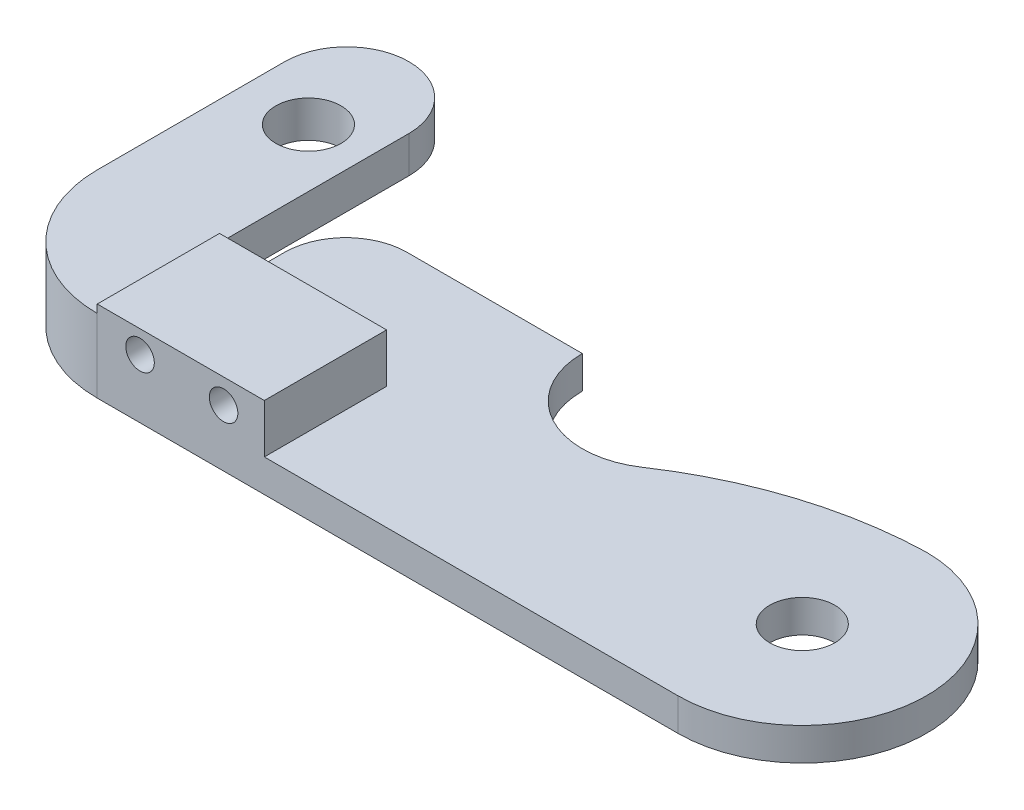
ISO-10303-21;
HEADER;
FILE_DESCRIPTION(('STEP AP214'),'2;1');
FILE_NAME('part.step','',(''),(''),'','','');
FILE_SCHEMA(('AUTOMOTIVE_DESIGN { 1 0 10303 214 1 1 1 1 }'));
ENDSEC;
DATA;
#1=APPLICATION_CONTEXT('core data for automotive mechanical design processes');
#2=APPLICATION_PROTOCOL_DEFINITION('international standard','automotive_design',2000,#1);
#3=PRODUCT_CONTEXT('',#1,'mechanical');
#4=PRODUCT('Part','Part','',(#3));
#5=PRODUCT_RELATED_PRODUCT_CATEGORY('part','',(#4));
#6=PRODUCT_DEFINITION_FORMATION('','',#4);
#7=PRODUCT_DEFINITION_CONTEXT('part definition',#1,'design');
#8=PRODUCT_DEFINITION('design','',#6,#7);
#9=PRODUCT_DEFINITION_SHAPE('','',#8);
#10=(LENGTH_UNIT() NAMED_UNIT(*) SI_UNIT(.MILLI.,.METRE.));
#11=(NAMED_UNIT(*) PLANE_ANGLE_UNIT() SI_UNIT($,.RADIAN.));
#12=(NAMED_UNIT(*) SI_UNIT($,.STERADIAN.) SOLID_ANGLE_UNIT());
#13=UNCERTAINTY_MEASURE_WITH_UNIT(LENGTH_MEASURE(1.E-05),#10,'distance_accuracy_value','');
#14=(GEOMETRIC_REPRESENTATION_CONTEXT(3) GLOBAL_UNCERTAINTY_ASSIGNED_CONTEXT((#13)) GLOBAL_UNIT_ASSIGNED_CONTEXT((#10,
#11,#12)) REPRESENTATION_CONTEXT('',''));
#15=CARTESIAN_POINT('',(0.,0.,0.));
#16=DIRECTION('',(0.,0.,1.));
#17=DIRECTION('',(1.,0.,0.));
#18=AXIS2_PLACEMENT_3D('',#15,#16,#17);
#19=CARTESIAN_POINT('',(-13.6869300911854,3.6,-4.17256838905775));
#20=DIRECTION('',(0.,0.,-1.));
#21=DIRECTION('',(-1.,0.,0.));
#22=AXIS2_PLACEMENT_3D('',#19,#20,#21);
#23=PLANE('',#22);
#24=DIRECTION('',(0.,-1.,0.));
#25=VECTOR('',#24,1.);
#26=CARTESIAN_POINT('',(-19.7869300911854,3.6,-4.17256838905775));
#27=LINE('',#26,#25);
#28=CARTESIAN_POINT('',(-19.7869300911854,1.8,-4.17256838905775));
#29=VERTEX_POINT('',#28);
#30=CARTESIAN_POINT('',(-19.7869300911854,0.,-4.17256838905775));
#31=VERTEX_POINT('',#30);
#32=EDGE_CURVE('E187',#29,#31,#27,.T.);
#33=ORIENTED_EDGE('',*,*,#32,.F.);
#34=DIRECTION('',(-1.,0.,0.));
#35=VECTOR('',#34,1.);
#36=CARTESIAN_POINT('',(-13.6869300911854,1.8,-4.17256838905775));
#37=LINE('',#36,#35);
#38=CARTESIAN_POINT('',(-13.6869300911854,1.8,-4.17256838905775));
#39=VERTEX_POINT('',#38);
#40=EDGE_CURVE('E163',#39,#29,#37,.T.);
#41=ORIENTED_EDGE('',*,*,#40,.F.);
#42=DIRECTION('',(0.,-1.,0.));
#43=VECTOR('',#42,1.);
#44=CARTESIAN_POINT('',(-13.6869300911854,3.6,-4.17256838905775));
#45=LINE('',#44,#43);
#46=CARTESIAN_POINT('',(-13.6869300911854,1.6,-4.17256838905775));
#47=VERTEX_POINT('',#46);
#48=EDGE_CURVE('E195',#39,#47,#45,.T.);
#49=ORIENTED_EDGE('',*,*,#48,.T.);
#50=CARTESIAN_POINT('',(-13.6869300911854,0.,-4.17256838905775));
#51=VERTEX_POINT('',#50);
#52=EDGE_CURVE('E197',#47,#51,#45,.T.);
#53=ORIENTED_EDGE('',*,*,#52,.T.);
#54=DIRECTION('',(1.,0.,0.));
#55=VECTOR('',#54,1.);
#56=CARTESIAN_POINT('',(-13.6869300911854,0.,-4.17256838905775));
#57=LINE('',#56,#55);
#58=EDGE_CURVE('E183',#31,#51,#57,.T.);
#59=ORIENTED_EDGE('',*,*,#58,.F.);
#60=EDGE_LOOP('',(#33,#41,#49,#53,#59));
#61=FACE_BOUND('',#60,.T.);
#62=ADVANCED_FACE('F32',(#61),#23,.T.);
#63=CARTESIAN_POINT('',(-13.6869300911854,1.6,-4.17256838905775));
#64=DIRECTION('',(1.,0.,0.));
#65=DIRECTION('',(0.,0.,-1.));
#66=AXIS2_PLACEMENT_3D('',#63,#64,#65);
#67=PLANE('',#66);
#68=DIRECTION('',(0.,0.,1.));
#69=VECTOR('',#68,1.);
#70=CARTESIAN_POINT('',(-13.6869300911854,3.6,1.92743161094225));
#71=LINE('',#70,#69);
#72=CARTESIAN_POINT('',(-13.6869300911854,3.6,-4.07256838905775));
#73=VERTEX_POINT('',#72);
#74=CARTESIAN_POINT('',(-13.6869300911854,3.6,1.92743161094225));
#75=VERTEX_POINT('',#74);
#76=EDGE_CURVE('E182',#73,#75,#71,.T.);
#77=ORIENTED_EDGE('',*,*,#76,.T.);
#78=DIRECTION('',(0.,-1.,0.));
#79=VECTOR('',#78,1.);
#80=CARTESIAN_POINT('',(-13.6869300911854,1.6,1.92743161094225));
#81=LINE('',#80,#79);
#82=CARTESIAN_POINT('',(-13.6869300911854,4.,1.92743161094225));
#83=VERTEX_POINT('',#82);
#84=EDGE_CURVE('E275',#83,#75,#81,.T.);
#85=ORIENTED_EDGE('',*,*,#84,.F.);
#86=DIRECTION('',(0.,0.,1.));
#87=VECTOR('',#86,1.);
#88=CARTESIAN_POINT('',(-13.6869300911854,4.,1.92743161094225));
#89=LINE('',#88,#87);
#90=CARTESIAN_POINT('',(-13.6869300911854,4.,-4.07256838905775));
#91=VERTEX_POINT('',#90);
#92=EDGE_CURVE('E216',#91,#83,#89,.T.);
#93=ORIENTED_EDGE('',*,*,#92,.F.);
#94=DIRECTION('',(0.,-1.,0.));
#95=VECTOR('',#94,1.);
#96=CARTESIAN_POINT('',(-13.6869300911854,4.,-4.07256838905775));
#97=LINE('',#96,#95);
#98=EDGE_CURVE('E230',#91,#73,#97,.T.);
#99=ORIENTED_EDGE('',*,*,#98,.T.);
#100=EDGE_LOOP('',(#77,#85,#93,#99));
#101=FACE_BOUND('',#100,.T.);
#102=ADVANCED_FACE('F333',(#101),#67,.F.);
#103=CARTESIAN_POINT('',(14.8130699088146,1.6,-4.17256838905775));
#104=DIRECTION('',(0.,1.,0.));
#105=DIRECTION('',(0.,0.,1.));
#106=AXIS2_PLACEMENT_3D('',#103,#104,#105);
#107=PLANE('',#106);
#108=CARTESIAN_POINT('',(14.8130699088146,1.6,-4.17256838905775));
#109=DIRECTION('',(0.,1.,0.));
#110=DIRECTION('',(0.,0.,1.));
#111=AXIS2_PLACEMENT_3D('',#108,#109,#110);
#112=CIRCLE('',#111,6.1);
#113=CARTESIAN_POINT('',(14.8130699088146,1.6,1.92743161094225));
#114=VERTEX_POINT('',#113);
#115=CARTESIAN_POINT('',(14.8130699088146,1.6,-10.2725683890578));
#116=VERTEX_POINT('',#115);
#117=EDGE_CURVE('E246',#114,#116,#112,.T.);
#118=ORIENTED_EDGE('',*,*,#117,.T.);
#119=CARTESIAN_POINT('',(15.3370849753878,1.6,9.72056563765262));
#120=DIRECTION('',(0.,1.,0.));
#121=DIRECTION('',(0.,0.,1.));
#122=AXIS2_PLACEMENT_3D('',#119,#120,#121);
#123=CIRCLE('',#122,20.);
#124=CARTESIAN_POINT('',(4.22106413000467,1.6,-6.9057412452666));
#125=VERTEX_POINT('',#124);
#126=EDGE_CURVE('E11',#116,#125,#123,.T.);
#127=ORIENTED_EDGE('',*,*,#126,.T.);
#128=CARTESIAN_POINT('',(1.97006990881458,1.6,-10.2725683890577));
#129=DIRECTION('',(0.,-1.,0.));
#130=DIRECTION('',(0.,0.,1.));
#131=AXIS2_PLACEMENT_3D('',#128,#129,#130);
#132=CIRCLE('',#131,4.05);
#133=CARTESIAN_POINT('',(-2.07993009118541,1.6,-10.2725683890577));
#134=VERTEX_POINT('',#133);
#135=EDGE_CURVE('E248',#125,#134,#132,.T.);
#136=ORIENTED_EDGE('',*,*,#135,.T.);
#137=DIRECTION('',(-1.,0.,0.));
#138=VECTOR('',#137,1.);
#139=CARTESIAN_POINT('',(-2.07993009118541,1.6,-10.2725683890577));
#140=LINE('',#139,#138);
#141=CARTESIAN_POINT('',(-10.6869300911854,1.6,-10.2725683890577));
#142=VERTEX_POINT('',#141);
#143=EDGE_CURVE('E251',#134,#142,#140,.T.);
#144=ORIENTED_EDGE('',*,*,#143,.T.);
#145=CARTESIAN_POINT('',(-10.6869300911854,1.6,-7.27256838905775));
#146=DIRECTION('',(0.,1.,0.));
#147=DIRECTION('',(0.,0.,1.));
#148=AXIS2_PLACEMENT_3D('',#145,#146,#147);
#149=CIRCLE('',#148,3.);
#150=CARTESIAN_POINT('',(-13.6869300911854,1.6,-7.27256838905775));
#151=VERTEX_POINT('',#150);
#152=EDGE_CURVE('E253',#142,#151,#149,.T.);
#153=ORIENTED_EDGE('',*,*,#152,.T.);
#154=DIRECTION('',(0.,0.,1.));
#155=VECTOR('',#154,1.);
#156=CARTESIAN_POINT('',(-13.6869300911854,1.6,-7.27256838905775));
#157=LINE('',#156,#155);
#158=EDGE_CURVE('E255',#151,#47,#157,.T.);
#159=ORIENTED_EDGE('',*,*,#158,.T.);
#160=DIRECTION('',(0.,0.,-1.));
#161=VECTOR('',#160,1.);
#162=CARTESIAN_POINT('',(-13.6869300911854,1.6,-4.17256838905775));
#163=LINE('',#162,#161);
#164=CARTESIAN_POINT('',(-13.6869300911854,1.6,-4.07256838905775));
#165=VERTEX_POINT('',#164);
#166=EDGE_CURVE('E194',#165,#47,#163,.T.);
#167=ORIENTED_EDGE('',*,*,#166,.F.);
#168=DIRECTION('',(-1.,0.,0.));
#169=VECTOR('',#168,1.);
#170=CARTESIAN_POINT('',(-13.6869300911854,1.6,-4.07256838905775));
#171=LINE('',#170,#169);
#172=CARTESIAN_POINT('',(-5.48693009118541,1.6,-4.07256838905775));
#173=VERTEX_POINT('',#172);
#174=EDGE_CURVE('E220',#173,#165,#171,.T.);
#175=ORIENTED_EDGE('',*,*,#174,.F.);
#176=DIRECTION('',(0.,0.,-1.));
#177=VECTOR('',#176,1.);
#178=CARTESIAN_POINT('',(-5.48693009118541,1.6,1.92743161094225));
#179=LINE('',#178,#177);
#180=CARTESIAN_POINT('',(-5.48693009118541,1.6,1.92743161094225));
#181=VERTEX_POINT('',#180);
#182=EDGE_CURVE('E211',#181,#173,#179,.T.);
#183=ORIENTED_EDGE('',*,*,#182,.F.);
#184=DIRECTION('',(1.,0.,0.));
#185=VECTOR('',#184,1.);
#186=CARTESIAN_POINT('',(-13.6869300911854,1.6,1.92743161094225));
#187=LINE('',#186,#185);
#188=EDGE_CURVE('E258',#181,#114,#187,.T.);
#189=ORIENTED_EDGE('',*,*,#188,.T.);
#190=EDGE_LOOP('',(#118,#127,#136,#144,#153,#159,#167,#175,#183,#189));
#191=FACE_BOUND('',#190,.T.);
#192=CARTESIAN_POINT('',(14.8130699088146,1.6,-4.17256838905775));
#193=DIRECTION('',(0.,1.,0.));
#194=DIRECTION('',(0.,0.,1.));
#195=AXIS2_PLACEMENT_3D('',#192,#193,#194);
#196=CIRCLE('',#195,1.6);
#197=CARTESIAN_POINT('',(14.8130699088146,1.6,-2.57256838905775));
#198=VERTEX_POINT('',#197);
#199=EDGE_CURVE('E240',#198,#198,#196,.T.);
#200=ORIENTED_EDGE('',*,*,#199,.F.);
#201=EDGE_LOOP('',(#200));
#202=FACE_BOUND('',#201,.T.);
#203=ADVANCED_FACE('F306',(#191,#202),#107,.T.);
#204=CARTESIAN_POINT('',(14.8130699088146,0.,-4.17256838905775));
#205=DIRECTION('',(0.,1.,0.));
#206=DIRECTION('',(0.,0.,1.));
#207=AXIS2_PLACEMENT_3D('',#204,#205,#206);
#208=PLANE('',#207);
#209=CARTESIAN_POINT('',(1.97006990881458,0.,-10.2725683890577));
#210=DIRECTION('',(0.,-1.,0.));
#211=DIRECTION('',(0.,0.,1.));
#212=AXIS2_PLACEMENT_3D('',#209,#210,#211);
#213=CIRCLE('',#212,4.05);
#214=CARTESIAN_POINT('',(4.22106413000467,0.,-6.9057412452666));
#215=VERTEX_POINT('',#214);
#216=CARTESIAN_POINT('',(-2.07993009118541,0.,-10.2725683890577));
#217=VERTEX_POINT('',#216);
#218=EDGE_CURVE('E263',#215,#217,#213,.T.);
#219=ORIENTED_EDGE('',*,*,#218,.F.);
#220=CARTESIAN_POINT('',(15.3370849753878,0.,9.72056563765262));
#221=DIRECTION('',(0.,1.,0.));
#222=DIRECTION('',(0.,0.,1.));
#223=AXIS2_PLACEMENT_3D('',#220,#221,#222);
#224=CIRCLE('',#223,20.);
#225=CARTESIAN_POINT('',(14.8130699088146,0.,-10.2725683890578));
#226=VERTEX_POINT('',#225);
#227=EDGE_CURVE('E40',#215,#226,#224,.F.);
#228=ORIENTED_EDGE('',*,*,#227,.T.);
#229=CARTESIAN_POINT('',(14.8130699088146,0.,-4.17256838905775));
#230=DIRECTION('',(0.,1.,0.));
#231=DIRECTION('',(0.,0.,1.));
#232=AXIS2_PLACEMENT_3D('',#229,#230,#231);
#233=CIRCLE('',#232,6.1);
#234=CARTESIAN_POINT('',(14.8130699088146,0.,1.92743161094225));
#235=VERTEX_POINT('',#234);
#236=EDGE_CURVE('E243',#235,#226,#233,.T.);
#237=ORIENTED_EDGE('',*,*,#236,.F.);
#238=DIRECTION('',(1.,0.,0.));
#239=VECTOR('',#238,1.);
#240=CARTESIAN_POINT('',(-13.6869300911854,0.,1.92743161094225));
#241=LINE('',#240,#239);
#242=CARTESIAN_POINT('',(-13.6869300911854,0.,1.92743161094225));
#243=VERTEX_POINT('',#242);
#244=EDGE_CURVE('E249',#243,#235,#241,.T.);
#245=ORIENTED_EDGE('',*,*,#244,.F.);
#246=CARTESIAN_POINT('',(-13.6869300911854,0.,-4.17256838905775));
#247=DIRECTION('',(0.,-1.,0.));
#248=DIRECTION('',(0.,0.,-1.));
#249=AXIS2_PLACEMENT_3D('',#246,#247,#248);
#250=CIRCLE('',#249,6.1);
#251=EDGE_CURVE('E179',#243,#31,#250,.T.);
#252=ORIENTED_EDGE('',*,*,#251,.T.);
#253=ORIENTED_EDGE('',*,*,#58,.T.);
#254=DIRECTION('',(0.,0.,1.));
#255=VECTOR('',#254,1.);
#256=CARTESIAN_POINT('',(-13.6869300911854,0.,-4.17256838905775));
#257=LINE('',#256,#255);
#258=CARTESIAN_POINT('',(-13.6869300911854,0.,-7.27256838905775));
#259=VERTEX_POINT('',#258);
#260=EDGE_CURVE('E270',#259,#51,#257,.T.);
#261=ORIENTED_EDGE('',*,*,#260,.F.);
#262=CARTESIAN_POINT('',(-10.6869300911854,0.,-7.27256838905775));
#263=DIRECTION('',(0.,1.,0.));
#264=DIRECTION('',(0.,0.,1.));
#265=AXIS2_PLACEMENT_3D('',#262,#263,#264);
#266=CIRCLE('',#265,3.);
#267=CARTESIAN_POINT('',(-10.6869300911854,0.,-10.2725683890577));
#268=VERTEX_POINT('',#267);
#269=EDGE_CURVE('E267',#268,#259,#266,.T.);
#270=ORIENTED_EDGE('',*,*,#269,.F.);
#271=DIRECTION('',(-1.,0.,0.));
#272=VECTOR('',#271,1.);
#273=CARTESIAN_POINT('',(-2.07993009118541,0.,-10.2725683890577));
#274=LINE('',#273,#272);
#275=EDGE_CURVE('E265',#217,#268,#274,.T.);
#276=ORIENTED_EDGE('',*,*,#275,.F.);
#277=EDGE_LOOP('',(#219,#228,#237,#245,#252,#253,#261,#270,#276));
#278=FACE_BOUND('',#277,.T.);
#279=CARTESIAN_POINT('',(14.8130699088146,0.,-4.17256838905775));
#280=DIRECTION('',(0.,1.,0.));
#281=DIRECTION('',(0.,0.,1.));
#282=AXIS2_PLACEMENT_3D('',#279,#280,#281);
#283=CIRCLE('',#282,1.6);
#284=CARTESIAN_POINT('',(14.8130699088146,0.,-2.57256838905775));
#285=VERTEX_POINT('',#284);
#286=EDGE_CURVE('E239',#285,#285,#283,.T.);
#287=ORIENTED_EDGE('',*,*,#286,.T.);
#288=EDGE_LOOP('',(#287));
#289=FACE_BOUND('',#288,.T.);
#290=ADVANCED_FACE('F293',(#278,#289),#208,.F.);
#291=CARTESIAN_POINT('',(14.8130699088146,1.6,-4.17256838905775));
#292=DIRECTION('',(0.,-1.,0.));
#293=DIRECTION('',(0.,0.,-1.));
#294=AXIS2_PLACEMENT_3D('',#291,#292,#293);
#295=CYLINDRICAL_SURFACE('',#294,6.1);
#296=ORIENTED_EDGE('',*,*,#236,.T.);
#297=DIRECTION('',(0.,-1.,0.));
#298=VECTOR('',#297,1.);
#299=CARTESIAN_POINT('',(14.8130699088146,1.6,-10.2725683890578));
#300=LINE('',#299,#298);
#301=EDGE_CURVE('E287',#116,#226,#300,.T.);
#302=ORIENTED_EDGE('',*,*,#301,.F.);
#303=ORIENTED_EDGE('',*,*,#117,.F.);
#304=DIRECTION('',(0.,-1.,0.));
#305=VECTOR('',#304,1.);
#306=CARTESIAN_POINT('',(14.8130699088146,1.6,1.92743161094225));
#307=LINE('',#306,#305);
#308=EDGE_CURVE('E260',#114,#235,#307,.T.);
#309=ORIENTED_EDGE('',*,*,#308,.T.);
#310=EDGE_LOOP('',(#296,#302,#303,#309));
#311=FACE_BOUND('',#310,.T.);
#312=ADVANCED_FACE('F299',(#311),#295,.T.);
#313=CARTESIAN_POINT('',(1.97006990881458,1.6,-10.2725683890577));
#314=DIRECTION('',(0.,-1.,0.));
#315=DIRECTION('',(0.,0.,-1.));
#316=AXIS2_PLACEMENT_3D('',#313,#314,#315);
#317=CYLINDRICAL_SURFACE('',#316,4.05);
#318=ORIENTED_EDGE('',*,*,#135,.F.);
#319=DIRECTION('',(0.,-1.,0.));
#320=VECTOR('',#319,1.);
#321=CARTESIAN_POINT('',(4.22106413000467,1.6,-6.9057412452666));
#322=LINE('',#321,#320);
#323=EDGE_CURVE('E289',#125,#215,#322,.T.);
#324=ORIENTED_EDGE('',*,*,#323,.T.);
#325=ORIENTED_EDGE('',*,*,#218,.T.);
#326=DIRECTION('',(0.,-1.,0.));
#327=VECTOR('',#326,1.);
#328=CARTESIAN_POINT('',(-2.07993009118541,1.6,-10.2725683890577));
#329=LINE('',#328,#327);
#330=EDGE_CURVE('E284',#134,#217,#329,.T.);
#331=ORIENTED_EDGE('',*,*,#330,.F.);
#332=EDGE_LOOP('',(#318,#324,#325,#331));
#333=FACE_BOUND('',#332,.T.);
#334=ADVANCED_FACE('F303',(#333),#317,.F.);
#335=CARTESIAN_POINT('',(-2.07993009118541,1.6,-10.2725683890577));
#336=DIRECTION('',(0.,0.,1.));
#337=DIRECTION('',(1.,0.,0.));
#338=AXIS2_PLACEMENT_3D('',#335,#336,#337);
#339=PLANE('',#338);
#340=ORIENTED_EDGE('',*,*,#275,.T.);
#341=DIRECTION('',(0.,-1.,0.));
#342=VECTOR('',#341,1.);
#343=CARTESIAN_POINT('',(-10.6869300911854,1.6,-10.2725683890577));
#344=LINE('',#343,#342);
#345=EDGE_CURVE('E281',#142,#268,#344,.T.);
#346=ORIENTED_EDGE('',*,*,#345,.F.);
#347=ORIENTED_EDGE('',*,*,#143,.F.);
#348=ORIENTED_EDGE('',*,*,#330,.T.);
#349=EDGE_LOOP('',(#340,#346,#347,#348));
#350=FACE_BOUND('',#349,.T.);
#351=ADVANCED_FACE('F312',(#350),#339,.F.);
#352=CARTESIAN_POINT('',(-10.6869300911854,1.6,-7.27256838905775));
#353=DIRECTION('',(0.,-1.,0.));
#354=DIRECTION('',(0.,0.,-1.));
#355=AXIS2_PLACEMENT_3D('',#352,#353,#354);
#356=CYLINDRICAL_SURFACE('',#355,3.);
#357=ORIENTED_EDGE('',*,*,#269,.T.);
#358=DIRECTION('',(0.,-1.,0.));
#359=VECTOR('',#358,1.);
#360=CARTESIAN_POINT('',(-13.6869300911854,1.6,-7.27256838905775));
#361=LINE('',#360,#359);
#362=EDGE_CURVE('E278',#151,#259,#361,.T.);
#363=ORIENTED_EDGE('',*,*,#362,.F.);
#364=ORIENTED_EDGE('',*,*,#152,.F.);
#365=ORIENTED_EDGE('',*,*,#345,.T.);
#366=EDGE_LOOP('',(#357,#363,#364,#365));
#367=FACE_BOUND('',#366,.T.);
#368=ADVANCED_FACE('F315',(#367),#356,.T.);
#369=ORIENTED_EDGE('',*,*,#260,.T.);
#370=ORIENTED_EDGE('',*,*,#52,.F.);
#371=ORIENTED_EDGE('',*,*,#158,.F.);
#372=ORIENTED_EDGE('',*,*,#362,.T.);
#373=EDGE_LOOP('',(#369,#370,#371,#372));
#374=FACE_BOUND('',#373,.T.);
#375=ADVANCED_FACE('F319',(#374),#67,.F.);
#376=CARTESIAN_POINT('',(-13.6869300911854,1.6,1.92743161094225));
#377=DIRECTION('',(0.,0.,-1.));
#378=DIRECTION('',(-1.,0.,0.));
#379=AXIS2_PLACEMENT_3D('',#376,#377,#378);
#380=PLANE('',#379);
#381=CARTESIAN_POINT('',(-11.5857111228219,2.8999702690643,1.92743161094225));
#382=DIRECTION('',(0.,0.,1.));
#383=DIRECTION('',(1.,0.,0.));
#384=AXIS2_PLACEMENT_3D('',#381,#382,#383);
#385=CIRCLE('',#384,0.7);
#386=CARTESIAN_POINT('',(-10.8857111228219,2.8999702690643,1.92743161094225));
#387=VERTEX_POINT('',#386);
#388=EDGE_CURVE('E204',#387,#387,#385,.T.);
#389=ORIENTED_EDGE('',*,*,#388,.F.);
#390=EDGE_LOOP('',(#389));
#391=FACE_BOUND('',#390,.T.);
#392=CARTESIAN_POINT('',(-7.48693009118541,2.8,1.92743161094225));
#393=DIRECTION('',(0.,0.,1.));
#394=DIRECTION('',(1.,0.,0.));
#395=AXIS2_PLACEMENT_3D('',#392,#393,#394);
#396=CIRCLE('',#395,0.7);
#397=CARTESIAN_POINT('',(-6.78693009118541,2.8,1.92743161094225));
#398=VERTEX_POINT('',#397);
#399=EDGE_CURVE('E203',#398,#398,#396,.T.);
#400=ORIENTED_EDGE('',*,*,#399,.F.);
#401=EDGE_LOOP('',(#400));
#402=FACE_BOUND('',#401,.T.);
#403=ORIENTED_EDGE('',*,*,#244,.T.);
#404=ORIENTED_EDGE('',*,*,#308,.F.);
#405=ORIENTED_EDGE('',*,*,#188,.F.);
#406=DIRECTION('',(0.,-1.,0.));
#407=VECTOR('',#406,1.);
#408=CARTESIAN_POINT('',(-5.48693009118541,4.,1.92743161094225));
#409=LINE('',#408,#407);
#410=CARTESIAN_POINT('',(-5.48693009118541,4.,1.92743161094225));
#411=VERTEX_POINT('',#410);
#412=EDGE_CURVE('E236',#411,#181,#409,.T.);
#413=ORIENTED_EDGE('',*,*,#412,.F.);
#414=DIRECTION('',(1.,0.,0.));
#415=VECTOR('',#414,1.);
#416=CARTESIAN_POINT('',(-13.6869300911854,4.,1.92743161094225));
#417=LINE('',#416,#415);
#418=EDGE_CURVE('E219',#83,#411,#417,.T.);
#419=ORIENTED_EDGE('',*,*,#418,.F.);
#420=ORIENTED_EDGE('',*,*,#84,.T.);
#421=DIRECTION('',(0.,-1.,0.));
#422=VECTOR('',#421,1.);
#423=CARTESIAN_POINT('',(-13.6869300911854,3.6,1.92743161094225));
#424=LINE('',#423,#422);
#425=EDGE_CURVE('E192',#75,#243,#424,.T.);
#426=ORIENTED_EDGE('',*,*,#425,.T.);
#427=EDGE_LOOP('',(#403,#404,#405,#413,#419,#420,#426));
#428=FACE_BOUND('',#427,.T.);
#429=ADVANCED_FACE('F342',(#391,#402,#428),#380,.F.);
#430=CARTESIAN_POINT('',(14.8130699088146,1.6,-4.17256838905775));
#431=DIRECTION('',(0.,-1.,0.));
#432=DIRECTION('',(0.,0.,-1.));
#433=AXIS2_PLACEMENT_3D('',#430,#431,#432);
#434=CYLINDRICAL_SURFACE('',#433,1.6);
#435=ORIENTED_EDGE('',*,*,#199,.T.);
#436=EDGE_LOOP('',(#435));
#437=FACE_BOUND('',#436,.T.);
#438=ORIENTED_EDGE('',*,*,#286,.F.);
#439=EDGE_LOOP('',(#438));
#440=FACE_BOUND('',#439,.T.);
#441=ADVANCED_FACE('F375',(#437,#440),#434,.F.);
#442=CARTESIAN_POINT('',(-5.48693009118541,4.,1.92743161094225));
#443=DIRECTION('',(-1.,0.,0.));
#444=DIRECTION('',(0.,0.,1.));
#445=AXIS2_PLACEMENT_3D('',#442,#443,#444);
#446=PLANE('',#445);
#447=ORIENTED_EDGE('',*,*,#182,.T.);
#448=DIRECTION('',(0.,-1.,0.));
#449=VECTOR('',#448,1.);
#450=CARTESIAN_POINT('',(-5.48693009118541,4.,-4.07256838905775));
#451=LINE('',#450,#449);
#452=CARTESIAN_POINT('',(-5.48693009118541,4.,-4.07256838905775));
#453=VERTEX_POINT('',#452);
#454=EDGE_CURVE('E233',#453,#173,#451,.T.);
#455=ORIENTED_EDGE('',*,*,#454,.F.);
#456=DIRECTION('',(0.,0.,-1.));
#457=VECTOR('',#456,1.);
#458=CARTESIAN_POINT('',(-5.48693009118541,4.,1.92743161094225));
#459=LINE('',#458,#457);
#460=EDGE_CURVE('E222',#411,#453,#459,.T.);
#461=ORIENTED_EDGE('',*,*,#460,.F.);
#462=ORIENTED_EDGE('',*,*,#412,.T.);
#463=EDGE_LOOP('',(#447,#455,#461,#462));
#464=FACE_BOUND('',#463,.T.);
#465=ADVANCED_FACE('F371',(#464),#446,.F.);
#466=CARTESIAN_POINT('',(-13.6869300911854,4.,-4.07256838905775));
#467=DIRECTION('',(0.,0.,1.));
#468=DIRECTION('',(1.,0.,0.));
#469=AXIS2_PLACEMENT_3D('',#466,#467,#468);
#470=PLANE('',#469);
#471=CARTESIAN_POINT('',(-11.5857111228219,2.8999702690643,-4.07256838905775));
#472=DIRECTION('',(0.,0.,1.));
#473=DIRECTION('',(1.,0.,0.));
#474=AXIS2_PLACEMENT_3D('',#471,#472,#473);
#475=CIRCLE('',#474,0.7);
#476=CARTESIAN_POINT('',(-10.8857111228219,2.8999702690643,-4.07256838905775));
#477=VERTEX_POINT('',#476);
#478=EDGE_CURVE('E207',#477,#477,#475,.F.);
#479=ORIENTED_EDGE('',*,*,#478,.F.);
#480=EDGE_LOOP('',(#479));
#481=FACE_BOUND('',#480,.T.);
#482=CARTESIAN_POINT('',(-7.48693009118541,2.8,-4.07256838905775));
#483=DIRECTION('',(0.,0.,1.));
#484=DIRECTION('',(1.,0.,0.));
#485=AXIS2_PLACEMENT_3D('',#482,#483,#484);
#486=CIRCLE('',#485,0.7);
#487=CARTESIAN_POINT('',(-6.78693009118541,2.8,-4.07256838905775));
#488=VERTEX_POINT('',#487);
#489=EDGE_CURVE('E208',#488,#488,#486,.F.);
#490=ORIENTED_EDGE('',*,*,#489,.F.);
#491=EDGE_LOOP('',(#490));
#492=FACE_BOUND('',#491,.T.);
#493=ORIENTED_EDGE('',*,*,#174,.T.);
#494=EDGE_CURVE('E226',#73,#165,#97,.T.);
#495=ORIENTED_EDGE('',*,*,#494,.F.);
#496=ORIENTED_EDGE('',*,*,#98,.F.);
#497=DIRECTION('',(-1.,0.,0.));
#498=VECTOR('',#497,1.);
#499=CARTESIAN_POINT('',(-13.6869300911854,4.,-4.07256838905775));
#500=LINE('',#499,#498);
#501=EDGE_CURVE('E224',#453,#91,#500,.T.);
#502=ORIENTED_EDGE('',*,*,#501,.F.);
#503=ORIENTED_EDGE('',*,*,#454,.T.);
#504=EDGE_LOOP('',(#493,#495,#496,#502,#503));
#505=FACE_BOUND('',#504,.T.);
#506=ADVANCED_FACE('F328',(#481,#492,#505),#470,.F.);
#507=CARTESIAN_POINT('',(0.,4.,0.));
#508=DIRECTION('',(0.,-1.,0.));
#509=DIRECTION('',(0.,0.,-1.));
#510=AXIS2_PLACEMENT_3D('',#507,#508,#509);
#511=PLANE('',#510);
#512=ORIENTED_EDGE('',*,*,#92,.T.);
#513=ORIENTED_EDGE('',*,*,#418,.T.);
#514=ORIENTED_EDGE('',*,*,#460,.T.);
#515=ORIENTED_EDGE('',*,*,#501,.T.);
#516=EDGE_LOOP('',(#512,#513,#514,#515));
#517=FACE_BOUND('',#516,.T.);
#518=ADVANCED_FACE('F364',(#517),#511,.F.);
#519=CARTESIAN_POINT('',(-7.48693009118541,2.8,-6.05246737638008));
#520=DIRECTION('',(0.,0.,1.));
#521=DIRECTION('',(1.,0.,0.));
#522=AXIS2_PLACEMENT_3D('',#519,#520,#521);
#523=CYLINDRICAL_SURFACE('',#522,0.7);
#524=ORIENTED_EDGE('',*,*,#489,.T.);
#525=EDGE_LOOP('',(#524));
#526=FACE_BOUND('',#525,.T.);
#527=ORIENTED_EDGE('',*,*,#399,.T.);
#528=EDGE_LOOP('',(#527));
#529=FACE_BOUND('',#528,.T.);
#530=ADVANCED_FACE('F360',(#526,#529),#523,.F.);
#531=CARTESIAN_POINT('',(-11.5857111228219,2.8999702690643,-6.05246737638008));
#532=DIRECTION('',(0.,0.,1.));
#533=DIRECTION('',(1.,0.,0.));
#534=AXIS2_PLACEMENT_3D('',#531,#532,#533);
#535=CYLINDRICAL_SURFACE('',#534,0.7);
#536=ORIENTED_EDGE('',*,*,#478,.T.);
#537=EDGE_LOOP('',(#536));
#538=FACE_BOUND('',#537,.T.);
#539=ORIENTED_EDGE('',*,*,#388,.T.);
#540=EDGE_LOOP('',(#539));
#541=FACE_BOUND('',#540,.T.);
#542=ADVANCED_FACE('F357',(#538,#541),#535,.F.);
#543=CARTESIAN_POINT('',(-13.6869300911854,3.6,-4.17256838905775));
#544=DIRECTION('',(0.,-1.,0.));
#545=DIRECTION('',(0.,0.,-1.));
#546=AXIS2_PLACEMENT_3D('',#543,#544,#545);
#547=CYLINDRICAL_SURFACE('',#546,6.1);
#548=ORIENTED_EDGE('',*,*,#251,.F.);
#549=ORIENTED_EDGE('',*,*,#425,.F.);
#550=CARTESIAN_POINT('',(-13.6869300911854,3.6,-4.17256838905775));
#551=DIRECTION('',(0.,-1.,0.));
#552=DIRECTION('',(0.,0.,-1.));
#553=AXIS2_PLACEMENT_3D('',#550,#551,#552);
#554=CIRCLE('',#553,6.1);
#555=CARTESIAN_POINT('',(-19.7869300911854,3.6,-4.17256838905775));
#556=VERTEX_POINT('',#555);
#557=EDGE_CURVE('E180',#75,#556,#554,.T.);
#558=ORIENTED_EDGE('',*,*,#557,.T.);
#559=EDGE_CURVE('E198',#556,#29,#27,.T.);
#560=ORIENTED_EDGE('',*,*,#559,.T.);
#561=ORIENTED_EDGE('',*,*,#32,.T.);
#562=EDGE_LOOP('',(#548,#549,#558,#560,#561));
#563=FACE_BOUND('',#562,.T.);
#564=ADVANCED_FACE('F340',(#563),#547,.T.);
#565=CARTESIAN_POINT('',(-13.6869300911854,3.6,1.92743161094225));
#566=DIRECTION('',(1.,0.,0.));
#567=DIRECTION('',(0.,0.,-1.));
#568=AXIS2_PLACEMENT_3D('',#565,#566,#567);
#569=PLANE('',#568);
#570=ORIENTED_EDGE('',*,*,#494,.T.);
#571=ORIENTED_EDGE('',*,*,#166,.T.);
#572=ORIENTED_EDGE('',*,*,#48,.F.);
#573=DIRECTION('',(0.,0.,1.));
#574=VECTOR('',#573,1.);
#575=CARTESIAN_POINT('',(-13.6869300911854,1.8,-13.3725683890578));
#576=LINE('',#575,#574);
#577=CARTESIAN_POINT('',(-13.6869300911854,1.8,-13.3725683890578));
#578=VERTEX_POINT('',#577);
#579=EDGE_CURVE('E164',#578,#39,#576,.T.);
#580=ORIENTED_EDGE('',*,*,#579,.F.);
#581=DIRECTION('',(0.,-1.,0.));
#582=VECTOR('',#581,1.);
#583=CARTESIAN_POINT('',(-13.6869300911854,3.6,-13.3725683890578));
#584=LINE('',#583,#582);
#585=CARTESIAN_POINT('',(-13.6869300911854,3.6,-13.3725683890578));
#586=VERTEX_POINT('',#585);
#587=EDGE_CURVE('E154',#586,#578,#584,.T.);
#588=ORIENTED_EDGE('',*,*,#587,.F.);
#589=EDGE_CURVE('E184',#586,#73,#71,.T.);
#590=ORIENTED_EDGE('',*,*,#589,.T.);
#591=EDGE_LOOP('',(#570,#571,#572,#580,#588,#590));
#592=FACE_BOUND('',#591,.T.);
#593=ADVANCED_FACE('F325',(#592),#569,.T.);
#594=CARTESIAN_POINT('',(-13.6869300911854,3.6,-4.17256838905775));
#595=DIRECTION('',(0.,-1.,0.));
#596=DIRECTION('',(0.,0.,-1.));
#597=AXIS2_PLACEMENT_3D('',#594,#595,#596);
#598=PLANE('',#597);
#599=CARTESIAN_POINT('',(-16.5300269748269,3.6,-11.2800549152977));
#600=DIRECTION('',(0.,1.,0.));
#601=DIRECTION('',(0.,0.,1.));
#602=AXIS2_PLACEMENT_3D('',#599,#600,#601);
#603=CIRCLE('',#602,1.6);
#604=CARTESIAN_POINT('',(-16.5300269748269,3.6,-9.6800549152977));
#605=VERTEX_POINT('',#604);
#606=EDGE_CURVE('E586',#605,#605,#603,.T.);
#607=ORIENTED_EDGE('',*,*,#606,.F.);
#608=EDGE_LOOP('',(#607));
#609=FACE_BOUND('',#608,.T.);
#610=ORIENTED_EDGE('',*,*,#557,.F.);
#611=ORIENTED_EDGE('',*,*,#76,.F.);
#612=ORIENTED_EDGE('',*,*,#589,.F.);
#613=CARTESIAN_POINT('',(-16.7369300911854,3.6,-13.3725683890578));
#614=DIRECTION('',(0.,1.,0.));
#615=DIRECTION('',(0.,0.,1.));
#616=AXIS2_PLACEMENT_3D('',#613,#614,#615);
#617=CIRCLE('',#616,3.05);
#618=CARTESIAN_POINT('',(-19.7869300911854,3.6,-13.3725683890578));
#619=VERTEX_POINT('',#618);
#620=EDGE_CURVE('E168',#586,#619,#617,.T.);
#621=ORIENTED_EDGE('',*,*,#620,.T.);
#622=DIRECTION('',(0.,0.,1.));
#623=VECTOR('',#622,1.);
#624=CARTESIAN_POINT('',(-19.7869300911854,3.6,-13.3725683890578));
#625=LINE('',#624,#623);
#626=EDGE_CURVE('E149',#619,#556,#625,.T.);
#627=ORIENTED_EDGE('',*,*,#626,.T.);
#628=EDGE_LOOP('',(#610,#611,#612,#621,#627));
#629=FACE_BOUND('',#628,.T.);
#630=ADVANCED_FACE('F336',(#609,#629),#598,.F.);
#631=CARTESIAN_POINT('',(-13.6869300911854,1.8,-13.3725683890578));
#632=DIRECTION('',(0.,1.,0.));
#633=DIRECTION('',(0.,0.,1.));
#634=AXIS2_PLACEMENT_3D('',#631,#632,#633);
#635=PLANE('',#634);
#636=CARTESIAN_POINT('',(-16.5300269748269,1.8,-11.2800549152977));
#637=DIRECTION('',(0.,1.,0.));
#638=DIRECTION('',(0.,0.,1.));
#639=AXIS2_PLACEMENT_3D('',#636,#637,#638);
#640=CIRCLE('',#639,1.6);
#641=CARTESIAN_POINT('',(-16.5300269748269,1.8,-9.6800549152977));
#642=VERTEX_POINT('',#641);
#643=EDGE_CURVE('E171',#642,#642,#640,.F.);
#644=ORIENTED_EDGE('',*,*,#643,.F.);
#645=EDGE_LOOP('',(#644));
#646=FACE_BOUND('',#645,.T.);
#647=ORIENTED_EDGE('',*,*,#40,.T.);
#648=DIRECTION('',(0.,0.,1.));
#649=VECTOR('',#648,1.);
#650=CARTESIAN_POINT('',(-19.7869300911854,1.8,-13.3725683890578));
#651=LINE('',#650,#649);
#652=CARTESIAN_POINT('',(-19.7869300911854,1.8,-13.3725683890578));
#653=VERTEX_POINT('',#652);
#654=EDGE_CURVE('E147',#653,#29,#651,.T.);
#655=ORIENTED_EDGE('',*,*,#654,.F.);
#656=CARTESIAN_POINT('',(-16.7369300911854,1.8,-13.3725683890578));
#657=DIRECTION('',(0.,1.,0.));
#658=DIRECTION('',(0.,0.,1.));
#659=AXIS2_PLACEMENT_3D('',#656,#657,#658);
#660=CIRCLE('',#659,3.05);
#661=EDGE_CURVE('E161',#653,#578,#660,.F.);
#662=ORIENTED_EDGE('',*,*,#661,.T.);
#663=ORIENTED_EDGE('',*,*,#579,.T.);
#664=EDGE_LOOP('',(#647,#655,#662,#663));
#665=FACE_BOUND('',#664,.T.);
#666=ADVANCED_FACE('F159',(#646,#665),#635,.F.);
#667=CARTESIAN_POINT('',(-19.7869300911854,3.6,-13.3725683890578));
#668=DIRECTION('',(1.,0.,0.));
#669=DIRECTION('',(0.,0.,-1.));
#670=AXIS2_PLACEMENT_3D('',#667,#668,#669);
#671=PLANE('',#670);
#672=ORIENTED_EDGE('',*,*,#559,.F.);
#673=ORIENTED_EDGE('',*,*,#626,.F.);
#674=DIRECTION('',(0.,1.,0.));
#675=VECTOR('',#674,1.);
#676=CARTESIAN_POINT('',(-19.7869300911854,3.6,-13.3725683890578));
#677=LINE('',#676,#675);
#678=EDGE_CURVE('E143',#653,#619,#677,.T.);
#679=ORIENTED_EDGE('',*,*,#678,.F.);
#680=ORIENTED_EDGE('',*,*,#654,.T.);
#681=EDGE_LOOP('',(#672,#673,#679,#680));
#682=FACE_BOUND('',#681,.T.);
#683=ADVANCED_FACE('F146',(#682),#671,.F.);
#684=CARTESIAN_POINT('',(-16.7369300911854,-5.02000733137436,-13.3725683890578));
#685=DIRECTION('',(0.,1.,0.));
#686=DIRECTION('',(0.,0.,1.));
#687=AXIS2_PLACEMENT_3D('',#684,#685,#686);
#688=CYLINDRICAL_SURFACE('',#687,3.05);
#689=ORIENTED_EDGE('',*,*,#661,.F.);
#690=ORIENTED_EDGE('',*,*,#678,.T.);
#691=ORIENTED_EDGE('',*,*,#620,.F.);
#692=ORIENTED_EDGE('',*,*,#587,.T.);
#693=EDGE_LOOP('',(#689,#690,#691,#692));
#694=FACE_BOUND('',#693,.T.);
#695=ADVANCED_FACE('F166',(#694),#688,.T.);
#696=CARTESIAN_POINT('',(-16.5300269748269,-2.72548339959391,-11.2800549152977));
#697=DIRECTION('',(0.,1.,0.));
#698=DIRECTION('',(0.,0.,1.));
#699=AXIS2_PLACEMENT_3D('',#696,#697,#698);
#700=CYLINDRICAL_SURFACE('',#699,1.6);
#701=ORIENTED_EDGE('',*,*,#643,.T.);
#702=EDGE_LOOP('',(#701));
#703=FACE_BOUND('',#702,.T.);
#704=ORIENTED_EDGE('',*,*,#606,.T.);
#705=EDGE_LOOP('',(#704));
#706=FACE_BOUND('',#705,.T.);
#707=ADVANCED_FACE('F479',(#703,#706),#700,.F.);
#708=CARTESIAN_POINT('',(15.3370849753878,1.6,9.72056563765262));
#709=DIRECTION('',(0.,-1.,0.));
#710=DIRECTION('',(0.,0.,-1.));
#711=AXIS2_PLACEMENT_3D('',#708,#709,#710);
#712=CYLINDRICAL_SURFACE('',#711,20.);
#713=ORIENTED_EDGE('',*,*,#126,.F.);
#714=ORIENTED_EDGE('',*,*,#301,.T.);
#715=ORIENTED_EDGE('',*,*,#227,.F.);
#716=ORIENTED_EDGE('',*,*,#323,.F.);
#717=EDGE_LOOP('',(#713,#714,#715,#716));
#718=FACE_BOUND('',#717,.T.);
#719=ADVANCED_FACE('F34',(#718),#712,.T.);
#720=CLOSED_SHELL('',(#62,#102,#203,#290,#312,#334,#351,#368,#375,#429,#441,#465,#506,#518,#530,
#542,#564,#593,#630,#666,#683,#695,#707,#719));
#721=MANIFOLD_SOLID_BREP('B2',#720);
#722=ADVANCED_BREP_SHAPE_REPRESENTATION('',(#18,#721),#14);
#723=SHAPE_DEFINITION_REPRESENTATION(#9,#722);
ENDSEC;
END-ISO-10303-21;
